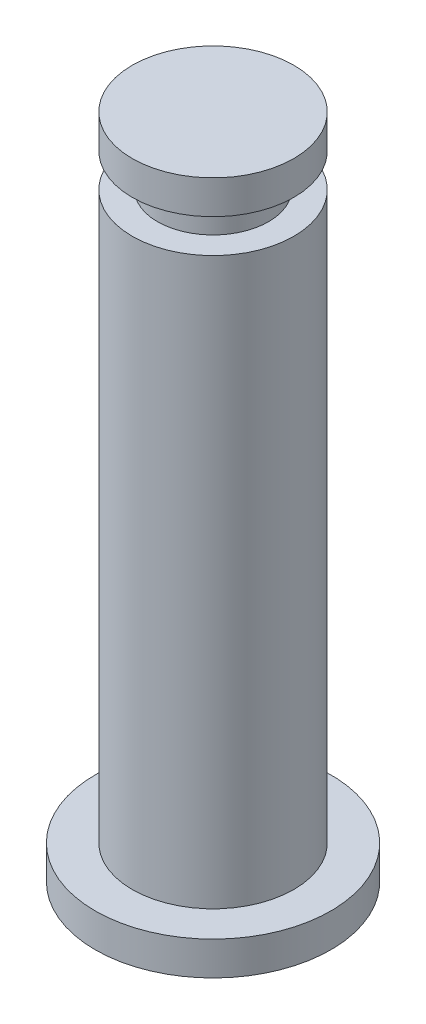
ISO-10303-21;
HEADER;
FILE_DESCRIPTION(('STEP AP214'),'2;1');
FILE_NAME('part.step','',(''),(''),'','','');
FILE_SCHEMA(('AUTOMOTIVE_DESIGN { 1 0 10303 214 1 1 1 1 }'));
ENDSEC;
DATA;
#1=APPLICATION_CONTEXT('core data for automotive mechanical design processes');
#2=APPLICATION_PROTOCOL_DEFINITION('international standard','automotive_design',2000,#1);
#3=PRODUCT_CONTEXT('',#1,'mechanical');
#4=PRODUCT('Part','Part','',(#3));
#5=PRODUCT_RELATED_PRODUCT_CATEGORY('part','',(#4));
#6=PRODUCT_DEFINITION_FORMATION('','',#4);
#7=PRODUCT_DEFINITION_CONTEXT('part definition',#1,'design');
#8=PRODUCT_DEFINITION('design','',#6,#7);
#9=PRODUCT_DEFINITION_SHAPE('','',#8);
#10=(LENGTH_UNIT() NAMED_UNIT(*) SI_UNIT(.MILLI.,.METRE.));
#11=(NAMED_UNIT(*) PLANE_ANGLE_UNIT() SI_UNIT($,.RADIAN.));
#12=(NAMED_UNIT(*) SI_UNIT($,.STERADIAN.) SOLID_ANGLE_UNIT());
#13=UNCERTAINTY_MEASURE_WITH_UNIT(LENGTH_MEASURE(1.E-05),#10,'distance_accuracy_value','');
#14=(GEOMETRIC_REPRESENTATION_CONTEXT(3) GLOBAL_UNCERTAINTY_ASSIGNED_CONTEXT((#13)) GLOBAL_UNIT_ASSIGNED_CONTEXT((#10,
#11,#12)) REPRESENTATION_CONTEXT('',''));
#15=CARTESIAN_POINT('',(0.,0.,0.));
#16=DIRECTION('',(0.,0.,1.));
#17=DIRECTION('',(1.,0.,0.));
#18=AXIS2_PLACEMENT_3D('',#15,#16,#17);
#19=CARTESIAN_POINT('',(0.,19.8,0.));
#20=DIRECTION('',(0.,-1.,0.));
#21=DIRECTION('',(0.,0.,-1.));
#22=AXIS2_PLACEMENT_3D('',#19,#20,#21);
#23=CYLINDRICAL_SURFACE('',#22,2.4);
#24=CARTESIAN_POINT('',(0.,1.,0.));
#25=DIRECTION('',(0.,1.,0.));
#26=DIRECTION('',(0.,0.,1.));
#27=AXIS2_PLACEMENT_3D('',#24,#25,#26);
#28=CIRCLE('',#27,2.4);
#29=CARTESIAN_POINT('',(0.,1.,-2.4));
#30=VERTEX_POINT('',#29);
#31=EDGE_CURVE('E50',#30,#30,#28,.T.);
#32=CARTESIAN_POINT('',(0.,17.8,0.));
#33=DIRECTION('',(0.,1.,0.));
#34=DIRECTION('',(0.,0.,1.));
#35=AXIS2_PLACEMENT_3D('',#32,#33,#34);
#36=CIRCLE('',#35,2.4);
#37=CARTESIAN_POINT('',(0.,17.8,-2.4));
#38=VERTEX_POINT('',#37);
#39=EDGE_CURVE('E57',#38,#38,#36,.T.);
#40=CARTESIAN_POINT('',(0.,1.,-2.4));
#41=CARTESIAN_POINT('',(0.,1.175,-2.4));
#42=CARTESIAN_POINT('',(0.,1.35,-2.4));
#43=CARTESIAN_POINT('',(0.,1.7,-2.4));
#44=CARTESIAN_POINT('',(0.,1.875,-2.4));
#45=CARTESIAN_POINT('',(0.,2.225,-2.4));
#46=CARTESIAN_POINT('',(0.,2.4,-2.4));
#47=CARTESIAN_POINT('',(0.,2.75,-2.4));
#48=CARTESIAN_POINT('',(0.,2.925,-2.4));
#49=CARTESIAN_POINT('',(0.,3.275,-2.4));
#50=CARTESIAN_POINT('',(0.,3.45,-2.4));
#51=CARTESIAN_POINT('',(0.,3.8,-2.4));
#52=CARTESIAN_POINT('',(0.,3.975,-2.4));
#53=CARTESIAN_POINT('',(0.,4.325,-2.4));
#54=CARTESIAN_POINT('',(0.,4.5,-2.4));
#55=CARTESIAN_POINT('',(0.,4.85,-2.4));
#56=CARTESIAN_POINT('',(0.,5.025,-2.4));
#57=CARTESIAN_POINT('',(0.,5.375,-2.4));
#58=CARTESIAN_POINT('',(0.,5.55,-2.4));
#59=CARTESIAN_POINT('',(0.,5.9,-2.4));
#60=CARTESIAN_POINT('',(0.,6.075,-2.4));
#61=CARTESIAN_POINT('',(0.,6.425,-2.4));
#62=CARTESIAN_POINT('',(0.,6.6,-2.4));
#63=CARTESIAN_POINT('',(0.,6.95,-2.4));
#64=CARTESIAN_POINT('',(0.,7.125,-2.4));
#65=CARTESIAN_POINT('',(0.,7.475,-2.4));
#66=CARTESIAN_POINT('',(0.,7.65,-2.4));
#67=CARTESIAN_POINT('',(0.,8.,-2.4));
#68=CARTESIAN_POINT('',(0.,8.175,-2.4));
#69=CARTESIAN_POINT('',(0.,8.525,-2.4));
#70=CARTESIAN_POINT('',(0.,8.7,-2.4));
#71=CARTESIAN_POINT('',(0.,9.05,-2.4));
#72=CARTESIAN_POINT('',(0.,9.225,-2.4));
#73=CARTESIAN_POINT('',(0.,9.575,-2.4));
#74=CARTESIAN_POINT('',(0.,9.75,-2.4));
#75=CARTESIAN_POINT('',(0.,10.1,-2.4));
#76=CARTESIAN_POINT('',(0.,10.275,-2.4));
#77=CARTESIAN_POINT('',(0.,10.625,-2.4));
#78=CARTESIAN_POINT('',(0.,10.8,-2.4));
#79=CARTESIAN_POINT('',(0.,11.15,-2.4));
#80=CARTESIAN_POINT('',(0.,11.325,-2.4));
#81=CARTESIAN_POINT('',(0.,11.675,-2.4));
#82=CARTESIAN_POINT('',(0.,11.85,-2.4));
#83=CARTESIAN_POINT('',(0.,12.2,-2.4));
#84=CARTESIAN_POINT('',(0.,12.375,-2.4));
#85=CARTESIAN_POINT('',(0.,12.725,-2.4));
#86=CARTESIAN_POINT('',(0.,12.9,-2.4));
#87=CARTESIAN_POINT('',(0.,13.25,-2.4));
#88=CARTESIAN_POINT('',(0.,13.425,-2.4));
#89=CARTESIAN_POINT('',(0.,13.775,-2.4));
#90=CARTESIAN_POINT('',(0.,13.95,-2.4));
#91=CARTESIAN_POINT('',(0.,14.3,-2.4));
#92=CARTESIAN_POINT('',(0.,14.475,-2.4));
#93=CARTESIAN_POINT('',(0.,14.825,-2.4));
#94=CARTESIAN_POINT('',(0.,15.,-2.4));
#95=CARTESIAN_POINT('',(0.,15.35,-2.4));
#96=CARTESIAN_POINT('',(0.,15.525,-2.4));
#97=CARTESIAN_POINT('',(0.,15.875,-2.4));
#98=CARTESIAN_POINT('',(0.,16.05,-2.4));
#99=CARTESIAN_POINT('',(0.,16.4,-2.4));
#100=CARTESIAN_POINT('',(0.,16.575,-2.4));
#101=CARTESIAN_POINT('',(0.,16.925,-2.4));
#102=CARTESIAN_POINT('',(0.,17.1,-2.4));
#103=CARTESIAN_POINT('',(0.,17.45,-2.4));
#104=CARTESIAN_POINT('',(0.,17.625,-2.4));
#105=CARTESIAN_POINT('',(0.,17.8,-2.4));
#106=B_SPLINE_CURVE_WITH_KNOTS('',3,(#40,#41,#42,#43,#44,#45,#46,#47,#48,#49,#50,#51,#52,#53,
#54,#55,#56,#57,#58,#59,#60,#61,#62,#63,#64,#65,#66,#67,#68,#69,#70,#71,#72,#73,#74,#75,#76,#77,
#78,#79,#80,#81,#82,#83,#84,#85,#86,#87,#88,#89,#90,#91,#92,#93,#94,#95,#96,#97,#98,#99,#100,
#101,#102,#103,#104,#105),.UNSPECIFIED.,.F.,.F.,(4,2,2,2,2,2,2,2,2,2,2,2,2,2,2,2,2,2,2,2,2,2,2,
2,2,2,2,2,2,2,2,2,4),(0.,0.525000000000001,1.05,1.575,2.1,2.625,3.15,3.675,4.2,4.725,5.25,5.775,
6.3,6.825,7.35,7.875,8.4,8.925,9.45,9.975,10.5,11.025,11.55,12.075,12.6,13.125,13.65,14.175,
14.7,15.225,15.75,16.275,16.8),.UNSPECIFIED.);
#107=EDGE_CURVE('BSEAM39',#30,#38,#106,.T.);
#108=ORIENTED_EDGE('',*,*,#31,.T.);
#109=ORIENTED_EDGE('',*,*,#39,.F.);
#110=ORIENTED_EDGE('',*,*,#107,.T.);
#111=ORIENTED_EDGE('',*,*,#107,.F.);
#112=EDGE_LOOP('',(#108,#110,#109,#111));
#113=FACE_BOUND('',#112,.T.);
#114=ADVANCED_FACE('F39',(#113),#23,.T.);
#115=CARTESIAN_POINT('',(0.,1.,0.));
#116=DIRECTION('',(0.,1.,0.));
#117=DIRECTION('',(0.,0.,1.));
#118=AXIS2_PLACEMENT_3D('',#115,#116,#117);
#119=PLANE('',#118);
#120=CARTESIAN_POINT('',(0.,1.,0.));
#121=DIRECTION('',(0.,1.,0.));
#122=DIRECTION('',(0.,0.,1.));
#123=AXIS2_PLACEMENT_3D('',#120,#121,#122);
#124=CIRCLE('',#123,3.5);
#125=CARTESIAN_POINT('',(0.,1.,3.5));
#126=VERTEX_POINT('',#125);
#127=EDGE_CURVE('E10',#126,#126,#124,.T.);
#128=ORIENTED_EDGE('',*,*,#127,.T.);
#129=EDGE_LOOP('',(#128));
#130=FACE_BOUND('',#129,.T.);
#131=ORIENTED_EDGE('',*,*,#31,.F.);
#132=EDGE_LOOP('',(#131));
#133=FACE_BOUND('',#132,.T.);
#134=ADVANCED_FACE('F81',(#130,#133),#119,.T.);
#135=CARTESIAN_POINT('',(0.,0.,0.));
#136=DIRECTION('',(0.,1.,0.));
#137=DIRECTION('',(0.,0.,1.));
#138=AXIS2_PLACEMENT_3D('',#135,#136,#137);
#139=PLANE('',#138);
#140=CARTESIAN_POINT('',(0.,0.,0.));
#141=DIRECTION('',(0.,1.,0.));
#142=DIRECTION('',(0.,0.,1.));
#143=AXIS2_PLACEMENT_3D('',#140,#141,#142);
#144=CIRCLE('',#143,3.5);
#145=CARTESIAN_POINT('',(0.,0.,3.5));
#146=VERTEX_POINT('',#145);
#147=EDGE_CURVE('E43',#146,#146,#144,.T.);
#148=ORIENTED_EDGE('',*,*,#147,.F.);
#149=EDGE_LOOP('',(#148));
#150=FACE_BOUND('',#149,.T.);
#151=ADVANCED_FACE('F89',(#150),#139,.F.);
#152=CARTESIAN_POINT('',(0.,1.,0.));
#153=DIRECTION('',(0.,-1.,0.));
#154=DIRECTION('',(0.,0.,-1.));
#155=AXIS2_PLACEMENT_3D('',#152,#153,#154);
#156=CYLINDRICAL_SURFACE('',#155,3.5);
#157=ORIENTED_EDGE('',*,*,#127,.F.);
#158=EDGE_LOOP('',(#157));
#159=FACE_BOUND('',#158,.T.);
#160=ORIENTED_EDGE('',*,*,#147,.T.);
#161=EDGE_LOOP('',(#160));
#162=FACE_BOUND('',#161,.T.);
#163=ADVANCED_FACE('F41',(#159,#162),#156,.T.);
#164=CARTESIAN_POINT('',(0.,17.8,0.));
#165=DIRECTION('',(0.,1.,0.));
#166=DIRECTION('',(0.,0.,1.));
#167=AXIS2_PLACEMENT_3D('',#164,#165,#166);
#168=PLANE('',#167);
#169=CARTESIAN_POINT('',(0.,17.8,0.));
#170=DIRECTION('',(0.,1.,0.));
#171=DIRECTION('',(0.,0.,1.));
#172=AXIS2_PLACEMENT_3D('',#169,#170,#171);
#173=CIRCLE('',#172,1.65);
#174=CARTESIAN_POINT('',(0.,17.8,1.65));
#175=VERTEX_POINT('',#174);
#176=EDGE_CURVE('E61',#175,#175,#173,.T.);
#177=ORIENTED_EDGE('',*,*,#176,.F.);
#178=EDGE_LOOP('',(#177));
#179=FACE_BOUND('',#178,.T.);
#180=ORIENTED_EDGE('',*,*,#39,.T.);
#181=EDGE_LOOP('',(#180));
#182=FACE_BOUND('',#181,.T.);
#183=ADVANCED_FACE('F73',(#179,#182),#168,.T.);
#184=CARTESIAN_POINT('',(0.,18.8,0.));
#185=DIRECTION('',(0.,1.,0.));
#186=DIRECTION('',(0.,0.,1.));
#187=AXIS2_PLACEMENT_3D('',#184,#185,#186);
#188=PLANE('',#187);
#189=CARTESIAN_POINT('',(0.,18.8,0.));
#190=DIRECTION('',(0.,1.,0.));
#191=DIRECTION('',(0.,0.,1.));
#192=AXIS2_PLACEMENT_3D('',#189,#190,#191);
#193=CIRCLE('',#192,1.65);
#194=CARTESIAN_POINT('',(0.,18.8,1.65));
#195=VERTEX_POINT('',#194);
#196=EDGE_CURVE('E64',#195,#195,#193,.T.);
#197=ORIENTED_EDGE('',*,*,#196,.T.);
#198=EDGE_LOOP('',(#197));
#199=FACE_BOUND('',#198,.T.);
#200=CARTESIAN_POINT('',(0.,18.8,0.));
#201=DIRECTION('',(0.,1.,0.));
#202=DIRECTION('',(0.,0.,1.));
#203=AXIS2_PLACEMENT_3D('',#200,#201,#202);
#204=CIRCLE('',#203,2.4);
#205=CARTESIAN_POINT('',(0.,18.8,-2.4));
#206=VERTEX_POINT('',#205);
#207=EDGE_CURVE('E58',#206,#206,#204,.T.);
#208=ORIENTED_EDGE('',*,*,#207,.F.);
#209=EDGE_LOOP('',(#208));
#210=FACE_BOUND('',#209,.T.);
#211=ADVANCED_FACE('F76',(#199,#210),#188,.F.);
#212=CARTESIAN_POINT('',(0.,17.8,0.));
#213=DIRECTION('',(0.,1.,0.));
#214=DIRECTION('',(0.,0.,1.));
#215=AXIS2_PLACEMENT_3D('',#212,#213,#214);
#216=CYLINDRICAL_SURFACE('',#215,1.65);
#217=ORIENTED_EDGE('',*,*,#176,.T.);
#218=EDGE_LOOP('',(#217));
#219=FACE_BOUND('',#218,.T.);
#220=ORIENTED_EDGE('',*,*,#196,.F.);
#221=EDGE_LOOP('',(#220));
#222=FACE_BOUND('',#221,.T.);
#223=ADVANCED_FACE('F70',(#219,#222),#216,.T.);
#224=CARTESIAN_POINT('',(0.,19.8,0.));
#225=DIRECTION('',(0.,1.,0.));
#226=DIRECTION('',(0.,0.,1.));
#227=AXIS2_PLACEMENT_3D('',#224,#225,#226);
#228=PLANE('',#227);
#229=CARTESIAN_POINT('',(0.,19.8,0.));
#230=DIRECTION('',(0.,1.,0.));
#231=DIRECTION('',(0.,0.,1.));
#232=AXIS2_PLACEMENT_3D('',#229,#230,#231);
#233=CIRCLE('',#232,2.4);
#234=CARTESIAN_POINT('',(0.,19.8,-2.4));
#235=VERTEX_POINT('',#234);
#236=EDGE_CURVE('E54',#235,#235,#233,.T.);
#237=ORIENTED_EDGE('',*,*,#236,.T.);
#238=EDGE_LOOP('',(#237));
#239=FACE_BOUND('',#238,.T.);
#240=ADVANCED_FACE('F93',(#239),#228,.T.);
#241=CARTESIAN_POINT('',(0.,18.8,-2.4));
#242=CARTESIAN_POINT('',(0.,18.8104166666667,-2.4));
#243=CARTESIAN_POINT('',(0.,18.8208333333333,-2.4));
#244=CARTESIAN_POINT('',(0.,18.8416666666667,-2.4));
#245=CARTESIAN_POINT('',(0.,18.8520833333333,-2.4));
#246=CARTESIAN_POINT('',(0.,18.8729166666667,-2.4));
#247=CARTESIAN_POINT('',(0.,18.8833333333333,-2.4));
#248=CARTESIAN_POINT('',(0.,18.9041666666667,-2.4));
#249=CARTESIAN_POINT('',(0.,18.9145833333333,-2.4));
#250=CARTESIAN_POINT('',(0.,18.9354166666667,-2.4));
#251=CARTESIAN_POINT('',(0.,18.9458333333333,-2.4));
#252=CARTESIAN_POINT('',(0.,18.9666666666667,-2.4));
#253=CARTESIAN_POINT('',(0.,18.9770833333333,-2.4));
#254=CARTESIAN_POINT('',(0.,18.9979166666667,-2.4));
#255=CARTESIAN_POINT('',(0.,19.0083333333333,-2.4));
#256=CARTESIAN_POINT('',(0.,19.0291666666667,-2.4));
#257=CARTESIAN_POINT('',(0.,19.0395833333333,-2.4));
#258=CARTESIAN_POINT('',(0.,19.0604166666667,-2.4));
#259=CARTESIAN_POINT('',(0.,19.0708333333333,-2.4));
#260=CARTESIAN_POINT('',(0.,19.0916666666667,-2.4));
#261=CARTESIAN_POINT('',(0.,19.1020833333333,-2.4));
#262=CARTESIAN_POINT('',(0.,19.1229166666667,-2.4));
#263=CARTESIAN_POINT('',(0.,19.1333333333333,-2.4));
#264=CARTESIAN_POINT('',(0.,19.1541666666667,-2.4));
#265=CARTESIAN_POINT('',(0.,19.1645833333333,-2.4));
#266=CARTESIAN_POINT('',(0.,19.1854166666667,-2.4));
#267=CARTESIAN_POINT('',(0.,19.1958333333333,-2.4));
#268=CARTESIAN_POINT('',(0.,19.2166666666667,-2.4));
#269=CARTESIAN_POINT('',(0.,19.2270833333333,-2.4));
#270=CARTESIAN_POINT('',(0.,19.2479166666667,-2.4));
#271=CARTESIAN_POINT('',(0.,19.2583333333333,-2.4));
#272=CARTESIAN_POINT('',(0.,19.2791666666667,-2.4));
#273=CARTESIAN_POINT('',(0.,19.2895833333333,-2.4));
#274=CARTESIAN_POINT('',(0.,19.3104166666667,-2.4));
#275=CARTESIAN_POINT('',(0.,19.3208333333333,-2.4));
#276=CARTESIAN_POINT('',(0.,19.3416666666667,-2.4));
#277=CARTESIAN_POINT('',(0.,19.3520833333333,-2.4));
#278=CARTESIAN_POINT('',(0.,19.3729166666667,-2.4));
#279=CARTESIAN_POINT('',(0.,19.3833333333333,-2.4));
#280=CARTESIAN_POINT('',(0.,19.4041666666667,-2.4));
#281=CARTESIAN_POINT('',(0.,19.4145833333333,-2.4));
#282=CARTESIAN_POINT('',(0.,19.4354166666667,-2.4));
#283=CARTESIAN_POINT('',(0.,19.4458333333333,-2.4));
#284=CARTESIAN_POINT('',(0.,19.4666666666667,-2.4));
#285=CARTESIAN_POINT('',(0.,19.4770833333333,-2.4));
#286=CARTESIAN_POINT('',(0.,19.4979166666667,-2.4));
#287=CARTESIAN_POINT('',(0.,19.5083333333333,-2.4));
#288=CARTESIAN_POINT('',(0.,19.5291666666667,-2.4));
#289=CARTESIAN_POINT('',(0.,19.5395833333333,-2.4));
#290=CARTESIAN_POINT('',(0.,19.5604166666667,-2.4));
#291=CARTESIAN_POINT('',(0.,19.5708333333333,-2.4));
#292=CARTESIAN_POINT('',(0.,19.5916666666667,-2.4));
#293=CARTESIAN_POINT('',(0.,19.6020833333333,-2.4));
#294=CARTESIAN_POINT('',(0.,19.6229166666667,-2.4));
#295=CARTESIAN_POINT('',(0.,19.6333333333333,-2.4));
#296=CARTESIAN_POINT('',(0.,19.6541666666667,-2.4));
#297=CARTESIAN_POINT('',(0.,19.6645833333333,-2.4));
#298=CARTESIAN_POINT('',(0.,19.6854166666667,-2.4));
#299=CARTESIAN_POINT('',(0.,19.6958333333333,-2.4));
#300=CARTESIAN_POINT('',(0.,19.7166666666667,-2.4));
#301=CARTESIAN_POINT('',(0.,19.7270833333333,-2.4));
#302=CARTESIAN_POINT('',(0.,19.7479166666667,-2.4));
#303=CARTESIAN_POINT('',(0.,19.7583333333333,-2.4));
#304=CARTESIAN_POINT('',(0.,19.7791666666667,-2.4));
#305=CARTESIAN_POINT('',(0.,19.7895833333333,-2.4));
#306=CARTESIAN_POINT('',(0.,19.8,-2.4));
#307=B_SPLINE_CURVE_WITH_KNOTS('',3,(#241,#242,#243,#244,#245,#246,#247,#248,#249,#250,#251,
#252,#253,#254,#255,#256,#257,#258,#259,#260,#261,#262,#263,#264,#265,#266,#267,#268,#269,#270,
#271,#272,#273,#274,#275,#276,#277,#278,#279,#280,#281,#282,#283,#284,#285,#286,#287,#288,#289,
#290,#291,#292,#293,#294,#295,#296,#297,#298,#299,#300,#301,#302,#303,#304,#305,#306),
.UNSPECIFIED.,.F.,.F.,(4,2,2,2,2,2,2,2,2,2,2,2,2,2,2,2,2,2,2,2,2,2,2,2,2,2,2,2,2,2,2,2,4),(0.,
0.03125,0.0625000000000001,0.0937500000000001,0.125,0.15625,0.1875,0.21875,0.25,0.28125,0.3125,
0.34375,0.375,0.40625,0.4375,0.46875,0.5,0.53125,0.5625,0.593750000000001,0.625000000000001,
0.656250000000001,0.687500000000001,0.718750000000001,0.750000000000001,0.781250000000001,
0.812500000000001,0.843750000000001,0.875000000000001,0.906250000000001,0.937500000000001,
0.968750000000001,1.),.UNSPECIFIED.);
#308=EDGE_CURVE('BSEAM84',#206,#235,#307,.T.);
#309=ORIENTED_EDGE('',*,*,#207,.T.);
#310=ORIENTED_EDGE('',*,*,#236,.F.);
#311=ORIENTED_EDGE('',*,*,#308,.T.);
#312=ORIENTED_EDGE('',*,*,#308,.F.);
#313=EDGE_LOOP('',(#309,#311,#310,#312));
#314=FACE_BOUND('',#313,.T.);
#315=ADVANCED_FACE('F84',(#314),#23,.T.);
#316=CLOSED_SHELL('',(#114,#134,#151,#163,#183,#211,#223,#240,#315));
#317=MANIFOLD_SOLID_BREP('B2',#316);
#318=ADVANCED_BREP_SHAPE_REPRESENTATION('',(#18,#317),#14);
#319=SHAPE_DEFINITION_REPRESENTATION(#9,#318);
ENDSEC;
END-ISO-10303-21;
